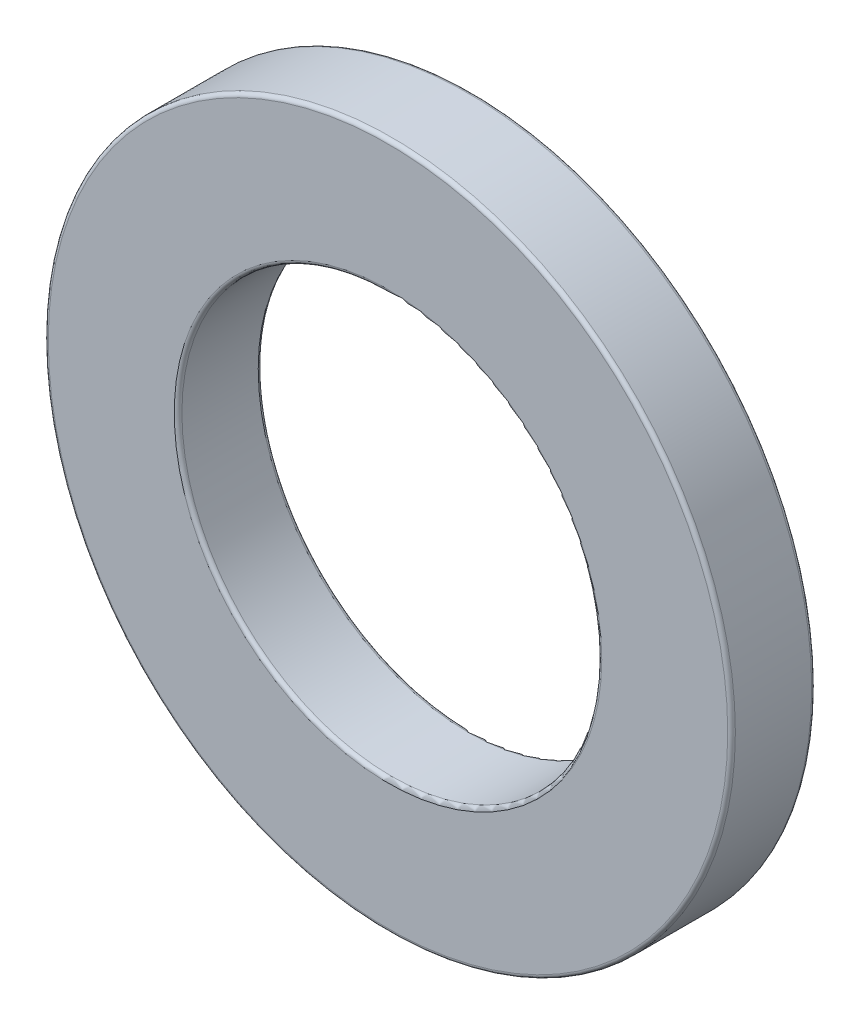
ISO-10303-21;
HEADER;
FILE_DESCRIPTION(('STEP AP214'),'2;1');
FILE_NAME('part.step','',(''),(''),'','','');
FILE_SCHEMA(('AUTOMOTIVE_DESIGN { 1 0 10303 214 1 1 1 1 }'));
ENDSEC;
DATA;
#1=APPLICATION_CONTEXT('core data for automotive mechanical design processes');
#2=APPLICATION_PROTOCOL_DEFINITION('international standard','automotive_design',2000,#1);
#3=PRODUCT_CONTEXT('',#1,'mechanical');
#4=PRODUCT('Part','Part','',(#3));
#5=PRODUCT_RELATED_PRODUCT_CATEGORY('part','',(#4));
#6=PRODUCT_DEFINITION_FORMATION('','',#4);
#7=PRODUCT_DEFINITION_CONTEXT('part definition',#1,'design');
#8=PRODUCT_DEFINITION('design','',#6,#7);
#9=PRODUCT_DEFINITION_SHAPE('','',#8);
#10=(LENGTH_UNIT() NAMED_UNIT(*) SI_UNIT(.MILLI.,.METRE.));
#11=(NAMED_UNIT(*) PLANE_ANGLE_UNIT() SI_UNIT($,.RADIAN.));
#12=(NAMED_UNIT(*) SI_UNIT($,.STERADIAN.) SOLID_ANGLE_UNIT());
#13=UNCERTAINTY_MEASURE_WITH_UNIT(LENGTH_MEASURE(1.E-05),#10,'distance_accuracy_value','');
#14=(GEOMETRIC_REPRESENTATION_CONTEXT(3) GLOBAL_UNCERTAINTY_ASSIGNED_CONTEXT((#13)) GLOBAL_UNIT_ASSIGNED_CONTEXT((#10,
#11,#12)) REPRESENTATION_CONTEXT('',''));
#15=CARTESIAN_POINT('',(0.,0.,0.));
#16=DIRECTION('',(0.,0.,1.));
#17=DIRECTION('',(1.,0.,0.));
#18=AXIS2_PLACEMENT_3D('',#15,#16,#17);
#19=CARTESIAN_POINT('',(0.,0.,11.));
#20=DIRECTION('',(0.,0.,1.));
#21=DIRECTION('',(1.,0.,0.));
#22=AXIS2_PLACEMENT_3D('',#19,#20,#21);
#23=PLANE('',#22);
#24=CARTESIAN_POINT('',(0.,0.,11.));
#25=DIRECTION('',(0.,0.,1.));
#26=DIRECTION('',(1.,0.,0.));
#27=AXIS2_PLACEMENT_3D('',#24,#25,#26);
#28=CIRCLE('',#27,44.5);
#29=CARTESIAN_POINT('',(44.5,0.,11.));
#30=VERTEX_POINT('',#29);
#31=EDGE_CURVE('E39',#30,#30,#28,.T.);
#32=ORIENTED_EDGE('',*,*,#31,.T.);
#33=EDGE_LOOP('',(#32));
#34=FACE_BOUND('',#33,.T.);
#35=CARTESIAN_POINT('',(0.,0.,11.));
#36=DIRECTION('',(0.,0.,1.));
#37=DIRECTION('',(1.,0.,0.));
#38=AXIS2_PLACEMENT_3D('',#35,#36,#37);
#39=CIRCLE('',#38,28.);
#40=CARTESIAN_POINT('',(28.,0.,11.));
#41=VERTEX_POINT('',#40);
#42=EDGE_CURVE('E43',#41,#41,#39,.F.);
#43=ORIENTED_EDGE('',*,*,#42,.T.);
#44=EDGE_LOOP('',(#43));
#45=FACE_BOUND('',#44,.T.);
#46=ADVANCED_FACE('F28',(#34,#45),#23,.T.);
#47=CARTESIAN_POINT('',(2.22044604925031E-13,-1.11022302462516E-13,0.));
#48=DIRECTION('',(0.,0.,1.));
#49=DIRECTION('',(1.,0.,0.));
#50=AXIS2_PLACEMENT_3D('',#47,#48,#49);
#51=PLANE('',#50);
#52=CARTESIAN_POINT('',(2.22044604925031E-13,-1.11022302462516E-13,0.));
#53=DIRECTION('',(0.,0.,1.));
#54=DIRECTION('',(1.,0.,0.));
#55=AXIS2_PLACEMENT_3D('',#52,#53,#54);
#56=CIRCLE('',#55,44.5);
#57=CARTESIAN_POINT('',(44.5000000000002,-1.15962794922098E-13,0.));
#58=VERTEX_POINT('',#57);
#59=EDGE_CURVE('E48',#58,#58,#56,.F.);
#60=ORIENTED_EDGE('',*,*,#59,.T.);
#61=EDGE_LOOP('',(#60));
#62=FACE_BOUND('',#61,.T.);
#63=CARTESIAN_POINT('',(2.22044604925031E-13,-1.11022302462516E-13,0.));
#64=DIRECTION('',(0.,0.,1.));
#65=DIRECTION('',(1.,0.,0.));
#66=AXIS2_PLACEMENT_3D('',#63,#64,#65);
#67=CIRCLE('',#66,28.);
#68=CARTESIAN_POINT('',(28.0000000000002,-1.14130926931466E-13,0.));
#69=VERTEX_POINT('',#68);
#70=EDGE_CURVE('E51',#69,#69,#67,.T.);
#71=ORIENTED_EDGE('',*,*,#70,.T.);
#72=EDGE_LOOP('',(#71));
#73=FACE_BOUND('',#72,.T.);
#74=ADVANCED_FACE('F73',(#62,#73),#51,.F.);
#75=CARTESIAN_POINT('',(0.,0.,11.));
#76=DIRECTION('',(0.,0.,-1.));
#77=DIRECTION('',(-1.,0.,0.));
#78=AXIS2_PLACEMENT_3D('',#75,#76,#77);
#79=CYLINDRICAL_SURFACE('',#78,45.);
#80=CARTESIAN_POINT('',(0.,0.,0.499999999999987));
#81=DIRECTION('',(0.,0.,1.));
#82=DIRECTION('',(1.,0.,0.));
#83=AXIS2_PLACEMENT_3D('',#80,#81,#82);
#84=CIRCLE('',#83,45.);
#85=CARTESIAN_POINT('',(-45.,0.,0.499999999999995));
#86=VERTEX_POINT('',#85);
#87=EDGE_CURVE('E54',#86,#86,#84,.T.);
#88=CARTESIAN_POINT('',(2.22044604925031E-13,3.33066907387547E-13,10.5));
#89=DIRECTION('',(0.,0.,1.));
#90=DIRECTION('',(1.,0.,0.));
#91=AXIS2_PLACEMENT_3D('',#88,#89,#90);
#92=CIRCLE('',#91,45.);
#93=CARTESIAN_POINT('',(-45.,0.,10.5));
#94=VERTEX_POINT('',#93);
#95=EDGE_CURVE('E57',#94,#94,#92,.F.);
#96=CARTESIAN_POINT('',(-45.,0.,0.499999999999995));
#97=CARTESIAN_POINT('',(-45.,0.,0.604166666666662));
#98=CARTESIAN_POINT('',(-45.,0.,0.708333333333329));
#99=CARTESIAN_POINT('',(-45.,0.,0.916666666666662));
#100=CARTESIAN_POINT('',(-45.,0.,1.02083333333333));
#101=CARTESIAN_POINT('',(-45.,0.,1.22916666666666));
#102=CARTESIAN_POINT('',(-45.,0.,1.33333333333333));
#103=CARTESIAN_POINT('',(-45.,0.,1.54166666666666));
#104=CARTESIAN_POINT('',(-45.,0.,1.64583333333333));
#105=CARTESIAN_POINT('',(-45.,0.,1.85416666666666));
#106=CARTESIAN_POINT('',(-45.,0.,1.95833333333333));
#107=CARTESIAN_POINT('',(-45.,0.,2.16666666666666));
#108=CARTESIAN_POINT('',(-45.,0.,2.27083333333333));
#109=CARTESIAN_POINT('',(-45.,0.,2.47916666666666));
#110=CARTESIAN_POINT('',(-45.,0.,2.58333333333333));
#111=CARTESIAN_POINT('',(-45.,0.,2.79166666666666));
#112=CARTESIAN_POINT('',(-45.,0.,2.89583333333333));
#113=CARTESIAN_POINT('',(-45.,0.,3.10416666666666));
#114=CARTESIAN_POINT('',(-45.,0.,3.20833333333333));
#115=CARTESIAN_POINT('',(-45.,0.,3.41666666666666));
#116=CARTESIAN_POINT('',(-45.,0.,3.52083333333333));
#117=CARTESIAN_POINT('',(-45.,0.,3.72916666666666));
#118=CARTESIAN_POINT('',(-45.,0.,3.83333333333333));
#119=CARTESIAN_POINT('',(-45.,0.,4.04166666666666));
#120=CARTESIAN_POINT('',(-45.,0.,4.14583333333333));
#121=CARTESIAN_POINT('',(-45.,0.,4.35416666666666));
#122=CARTESIAN_POINT('',(-45.,0.,4.45833333333333));
#123=CARTESIAN_POINT('',(-45.,0.,4.66666666666666));
#124=CARTESIAN_POINT('',(-45.,0.,4.77083333333333));
#125=CARTESIAN_POINT('',(-45.,0.,4.97916666666666));
#126=CARTESIAN_POINT('',(-45.,0.,5.08333333333333));
#127=CARTESIAN_POINT('',(-45.,0.,5.29166666666666));
#128=CARTESIAN_POINT('',(-45.,0.,5.39583333333333));
#129=CARTESIAN_POINT('',(-45.,0.,5.60416666666666));
#130=CARTESIAN_POINT('',(-45.,0.,5.70833333333333));
#131=CARTESIAN_POINT('',(-45.,0.,5.91666666666666));
#132=CARTESIAN_POINT('',(-45.,0.,6.02083333333333));
#133=CARTESIAN_POINT('',(-45.,0.,6.22916666666666));
#134=CARTESIAN_POINT('',(-45.,0.,6.33333333333333));
#135=CARTESIAN_POINT('',(-45.,0.,6.54166666666666));
#136=CARTESIAN_POINT('',(-45.,0.,6.64583333333333));
#137=CARTESIAN_POINT('',(-45.,0.,6.85416666666666));
#138=CARTESIAN_POINT('',(-45.,0.,6.95833333333333));
#139=CARTESIAN_POINT('',(-45.,0.,7.16666666666666));
#140=CARTESIAN_POINT('',(-45.,0.,7.27083333333333));
#141=CARTESIAN_POINT('',(-45.,0.,7.47916666666666));
#142=CARTESIAN_POINT('',(-45.,0.,7.58333333333333));
#143=CARTESIAN_POINT('',(-45.,0.,7.79166666666666));
#144=CARTESIAN_POINT('',(-45.,0.,7.89583333333333));
#145=CARTESIAN_POINT('',(-45.,0.,8.10416666666666));
#146=CARTESIAN_POINT('',(-45.,0.,8.20833333333333));
#147=CARTESIAN_POINT('',(-45.,0.,8.41666666666666));
#148=CARTESIAN_POINT('',(-45.,0.,8.52083333333333));
#149=CARTESIAN_POINT('',(-45.,0.,8.72916666666666));
#150=CARTESIAN_POINT('',(-45.,0.,8.83333333333332));
#151=CARTESIAN_POINT('',(-45.,0.,9.04166666666666));
#152=CARTESIAN_POINT('',(-45.,0.,9.14583333333332));
#153=CARTESIAN_POINT('',(-45.,0.,9.35416666666666));
#154=CARTESIAN_POINT('',(-45.,0.,9.45833333333332));
#155=CARTESIAN_POINT('',(-45.,0.,9.66666666666666));
#156=CARTESIAN_POINT('',(-45.,0.,9.77083333333332));
#157=CARTESIAN_POINT('',(-45.,0.,9.97916666666666));
#158=CARTESIAN_POINT('',(-45.,0.,10.0833333333333));
#159=CARTESIAN_POINT('',(-45.,0.,10.2916666666667));
#160=CARTESIAN_POINT('',(-45.,0.,10.3958333333333));
#161=CARTESIAN_POINT('',(-45.,0.,10.5));
#162=B_SPLINE_CURVE_WITH_KNOTS('',3,(#96,#97,#98,#99,#100,#101,#102,#103,#104,#105,#106,#107,
#108,#109,#110,#111,#112,#113,#114,#115,#116,#117,#118,#119,#120,#121,#122,#123,#124,#125,#126,
#127,#128,#129,#130,#131,#132,#133,#134,#135,#136,#137,#138,#139,#140,#141,#142,#143,#144,#145,
#146,#147,#148,#149,#150,#151,#152,#153,#154,#155,#156,#157,#158,#159,#160,#161),.UNSPECIFIED.,
.F.,.F.,(4,2,2,2,2,2,2,2,2,2,2,2,2,2,2,2,2,2,2,2,2,2,2,2,2,2,2,2,2,2,2,2,4),(0.,0.3125,
0.625000000000001,0.937499999999999,1.25,1.5625,1.875,2.1875,2.5,2.8125,3.125,3.4375,3.75,
4.0625,4.375,4.6875,5.,5.3125,5.625,5.9375,6.25,6.5625,6.875,7.1875,7.5,7.8125,8.12499999999999,
8.43749999999999,8.75,9.0625,9.37499999999999,9.68749999999999,9.99999999999999),.UNSPECIFIED.);
#163=EDGE_CURVE('BSEAM61',#86,#94,#162,.T.);
#164=ORIENTED_EDGE('',*,*,#87,.T.);
#165=ORIENTED_EDGE('',*,*,#95,.T.);
#166=ORIENTED_EDGE('',*,*,#163,.T.);
#167=ORIENTED_EDGE('',*,*,#163,.F.);
#168=EDGE_LOOP('',(#164,#166,#165,#167));
#169=FACE_BOUND('',#168,.T.);
#170=ADVANCED_FACE('F61',(#169),#79,.T.);
#171=CARTESIAN_POINT('',(0.,0.,11.));
#172=DIRECTION('',(0.,0.,-1.));
#173=DIRECTION('',(-1.,0.,0.));
#174=AXIS2_PLACEMENT_3D('',#171,#172,#173);
#175=CYLINDRICAL_SURFACE('',#174,27.5);
#176=CARTESIAN_POINT('',(0.,0.,0.499999999999987));
#177=DIRECTION('',(0.,0.,1.));
#178=DIRECTION('',(1.,0.,0.));
#179=AXIS2_PLACEMENT_3D('',#176,#177,#178);
#180=CIRCLE('',#179,27.5);
#181=CARTESIAN_POINT('',(-27.5,0.,0.499999999999994));
#182=VERTEX_POINT('',#181);
#183=EDGE_CURVE('E10',#182,#182,#180,.F.);
#184=CARTESIAN_POINT('',(2.22044604925031E-13,3.33066907387547E-13,10.5));
#185=DIRECTION('',(0.,0.,1.));
#186=DIRECTION('',(1.,0.,0.));
#187=AXIS2_PLACEMENT_3D('',#184,#185,#186);
#188=CIRCLE('',#187,27.5);
#189=CARTESIAN_POINT('',(-27.5,0.,10.5));
#190=VERTEX_POINT('',#189);
#191=EDGE_CURVE('E35',#190,#190,#188,.T.);
#192=CARTESIAN_POINT('',(-27.5,0.,0.499999999999994));
#193=CARTESIAN_POINT('',(-27.5,0.,0.60416666666666));
#194=CARTESIAN_POINT('',(-27.5,0.,0.708333333333327));
#195=CARTESIAN_POINT('',(-27.5,0.,0.916666666666661));
#196=CARTESIAN_POINT('',(-27.5,0.,1.02083333333333));
#197=CARTESIAN_POINT('',(-27.5,0.,1.22916666666666));
#198=CARTESIAN_POINT('',(-27.5,0.,1.33333333333333));
#199=CARTESIAN_POINT('',(-27.5,0.,1.54166666666666));
#200=CARTESIAN_POINT('',(-27.5,0.,1.64583333333333));
#201=CARTESIAN_POINT('',(-27.5,0.,1.85416666666666));
#202=CARTESIAN_POINT('',(-27.5,0.,1.95833333333333));
#203=CARTESIAN_POINT('',(-27.5,0.,2.16666666666666));
#204=CARTESIAN_POINT('',(-27.5,0.,2.27083333333333));
#205=CARTESIAN_POINT('',(-27.5,0.,2.47916666666666));
#206=CARTESIAN_POINT('',(-27.5,0.,2.58333333333333));
#207=CARTESIAN_POINT('',(-27.5,0.,2.79166666666666));
#208=CARTESIAN_POINT('',(-27.5,0.,2.89583333333333));
#209=CARTESIAN_POINT('',(-27.5,0.,3.10416666666666));
#210=CARTESIAN_POINT('',(-27.5,0.,3.20833333333333));
#211=CARTESIAN_POINT('',(-27.5,0.,3.41666666666666));
#212=CARTESIAN_POINT('',(-27.5,0.,3.52083333333333));
#213=CARTESIAN_POINT('',(-27.5,0.,3.72916666666666));
#214=CARTESIAN_POINT('',(-27.5,0.,3.83333333333333));
#215=CARTESIAN_POINT('',(-27.5,0.,4.04166666666666));
#216=CARTESIAN_POINT('',(-27.5,0.,4.14583333333333));
#217=CARTESIAN_POINT('',(-27.5,0.,4.35416666666666));
#218=CARTESIAN_POINT('',(-27.5,0.,4.45833333333333));
#219=CARTESIAN_POINT('',(-27.5,0.,4.66666666666666));
#220=CARTESIAN_POINT('',(-27.5,0.,4.77083333333333));
#221=CARTESIAN_POINT('',(-27.5,0.,4.97916666666666));
#222=CARTESIAN_POINT('',(-27.5,0.,5.08333333333332));
#223=CARTESIAN_POINT('',(-27.5,0.,5.29166666666666));
#224=CARTESIAN_POINT('',(-27.5,0.,5.39583333333332));
#225=CARTESIAN_POINT('',(-27.5,0.,5.60416666666666));
#226=CARTESIAN_POINT('',(-27.5,0.,5.70833333333332));
#227=CARTESIAN_POINT('',(-27.5,0.,5.91666666666666));
#228=CARTESIAN_POINT('',(-27.5,0.,6.02083333333332));
#229=CARTESIAN_POINT('',(-27.5,0.,6.22916666666666));
#230=CARTESIAN_POINT('',(-27.5,0.,6.33333333333332));
#231=CARTESIAN_POINT('',(-27.5,0.,6.54166666666666));
#232=CARTESIAN_POINT('',(-27.5,0.,6.64583333333332));
#233=CARTESIAN_POINT('',(-27.5,0.,6.85416666666666));
#234=CARTESIAN_POINT('',(-27.5,0.,6.95833333333332));
#235=CARTESIAN_POINT('',(-27.5,0.,7.16666666666666));
#236=CARTESIAN_POINT('',(-27.5,0.,7.27083333333332));
#237=CARTESIAN_POINT('',(-27.5,0.,7.47916666666666));
#238=CARTESIAN_POINT('',(-27.5,0.,7.58333333333332));
#239=CARTESIAN_POINT('',(-27.5,0.,7.79166666666666));
#240=CARTESIAN_POINT('',(-27.5,0.,7.89583333333332));
#241=CARTESIAN_POINT('',(-27.5,0.,8.10416666666666));
#242=CARTESIAN_POINT('',(-27.5,0.,8.20833333333332));
#243=CARTESIAN_POINT('',(-27.5,0.,8.41666666666666));
#244=CARTESIAN_POINT('',(-27.5,0.,8.52083333333332));
#245=CARTESIAN_POINT('',(-27.5,0.,8.72916666666665));
#246=CARTESIAN_POINT('',(-27.5,0.,8.83333333333332));
#247=CARTESIAN_POINT('',(-27.5,0.,9.04166666666665));
#248=CARTESIAN_POINT('',(-27.5,0.,9.14583333333332));
#249=CARTESIAN_POINT('',(-27.5,0.,9.35416666666666));
#250=CARTESIAN_POINT('',(-27.5,0.,9.45833333333332));
#251=CARTESIAN_POINT('',(-27.5,0.,9.66666666666665));
#252=CARTESIAN_POINT('',(-27.5,0.,9.77083333333332));
#253=CARTESIAN_POINT('',(-27.5,0.,9.97916666666665));
#254=CARTESIAN_POINT('',(-27.5,0.,10.0833333333333));
#255=CARTESIAN_POINT('',(-27.5,0.,10.2916666666667));
#256=CARTESIAN_POINT('',(-27.5,0.,10.3958333333333));
#257=CARTESIAN_POINT('',(-27.5,0.,10.5));
#258=B_SPLINE_CURVE_WITH_KNOTS('',3,(#192,#193,#194,#195,#196,#197,#198,#199,#200,#201,#202,
#203,#204,#205,#206,#207,#208,#209,#210,#211,#212,#213,#214,#215,#216,#217,#218,#219,#220,#221,
#222,#223,#224,#225,#226,#227,#228,#229,#230,#231,#232,#233,#234,#235,#236,#237,#238,#239,#240,
#241,#242,#243,#244,#245,#246,#247,#248,#249,#250,#251,#252,#253,#254,#255,#256,#257),
.UNSPECIFIED.,.F.,.F.,(4,2,2,2,2,2,2,2,2,2,2,2,2,2,2,2,2,2,2,2,2,2,2,2,2,2,2,2,2,2,2,2,4),(0.,
0.3125,0.625000000000001,0.937499999999999,1.25,1.5625,1.875,2.1875,2.5,2.8125,3.125,3.4375,
3.75,4.0625,4.375,4.6875,5.,5.3125,5.625,5.9375,6.25,6.5625,6.875,7.18749999999999,7.5,
7.81249999999999,8.12499999999999,8.43749999999999,8.74999999999999,9.06249999999999,
9.37499999999999,9.68749999999999,9.99999999999999),.UNSPECIFIED.);
#259=EDGE_CURVE('BSEAM89',#182,#190,#258,.T.);
#260=ORIENTED_EDGE('',*,*,#183,.T.);
#261=ORIENTED_EDGE('',*,*,#191,.T.);
#262=ORIENTED_EDGE('',*,*,#259,.T.);
#263=ORIENTED_EDGE('',*,*,#259,.F.);
#264=EDGE_LOOP('',(#260,#262,#261,#263));
#265=FACE_BOUND('',#264,.T.);
#266=ADVANCED_FACE('F89',(#265),#175,.F.);
#267=CARTESIAN_POINT('',(0.,0.,0.499999999999987));
#268=DIRECTION('',(0.,0.,1.));
#269=DIRECTION('',(1.,0.,0.));
#270=AXIS2_PLACEMENT_3D('',#267,#268,#269);
#271=TOROIDAL_SURFACE('',#270,44.5,0.5);
#272=ORIENTED_EDGE('',*,*,#59,.F.);
#273=EDGE_LOOP('',(#272));
#274=FACE_BOUND('',#273,.T.);
#275=ORIENTED_EDGE('',*,*,#87,.F.);
#276=EDGE_LOOP('',(#275));
#277=FACE_BOUND('',#276,.T.);
#278=ADVANCED_FACE('F67',(#274,#277),#271,.T.);
#279=CARTESIAN_POINT('',(2.22044604925031E-13,3.33066907387547E-13,10.5));
#280=DIRECTION('',(0.,0.,1.));
#281=DIRECTION('',(1.,0.,0.));
#282=AXIS2_PLACEMENT_3D('',#279,#280,#281);
#283=TOROIDAL_SURFACE('',#282,44.5,0.5);
#284=ORIENTED_EDGE('',*,*,#95,.F.);
#285=EDGE_LOOP('',(#284));
#286=FACE_BOUND('',#285,.T.);
#287=ORIENTED_EDGE('',*,*,#31,.F.);
#288=EDGE_LOOP('',(#287));
#289=FACE_BOUND('',#288,.T.);
#290=ADVANCED_FACE('F63',(#286,#289),#283,.T.);
#291=CARTESIAN_POINT('',(0.,0.,0.499999999999987));
#292=DIRECTION('',(0.,0.,1.));
#293=DIRECTION('',(1.,0.,0.));
#294=AXIS2_PLACEMENT_3D('',#291,#292,#293);
#295=TOROIDAL_SURFACE('',#294,28.,0.5);
#296=ORIENTED_EDGE('',*,*,#183,.F.);
#297=EDGE_LOOP('',(#296));
#298=FACE_BOUND('',#297,.T.);
#299=ORIENTED_EDGE('',*,*,#70,.F.);
#300=EDGE_LOOP('',(#299));
#301=FACE_BOUND('',#300,.T.);
#302=ADVANCED_FACE('F66',(#298,#301),#295,.T.);
#303=CARTESIAN_POINT('',(2.22044604925031E-13,3.33066907387547E-13,10.5));
#304=DIRECTION('',(0.,0.,1.));
#305=DIRECTION('',(1.,0.,0.));
#306=AXIS2_PLACEMENT_3D('',#303,#304,#305);
#307=TOROIDAL_SURFACE('',#306,28.,0.5);
#308=ORIENTED_EDGE('',*,*,#42,.F.);
#309=EDGE_LOOP('',(#308));
#310=FACE_BOUND('',#309,.T.);
#311=ORIENTED_EDGE('',*,*,#191,.F.);
#312=EDGE_LOOP('',(#311));
#313=FACE_BOUND('',#312,.T.);
#314=ADVANCED_FACE('F30',(#310,#313),#307,.T.);
#315=CLOSED_SHELL('',(#46,#74,#170,#266,#278,#290,#302,#314));
#316=MANIFOLD_SOLID_BREP('B2',#315);
#317=ADVANCED_BREP_SHAPE_REPRESENTATION('',(#18,#316),#14);
#318=SHAPE_DEFINITION_REPRESENTATION(#9,#317);
ENDSEC;
END-ISO-10303-21;
